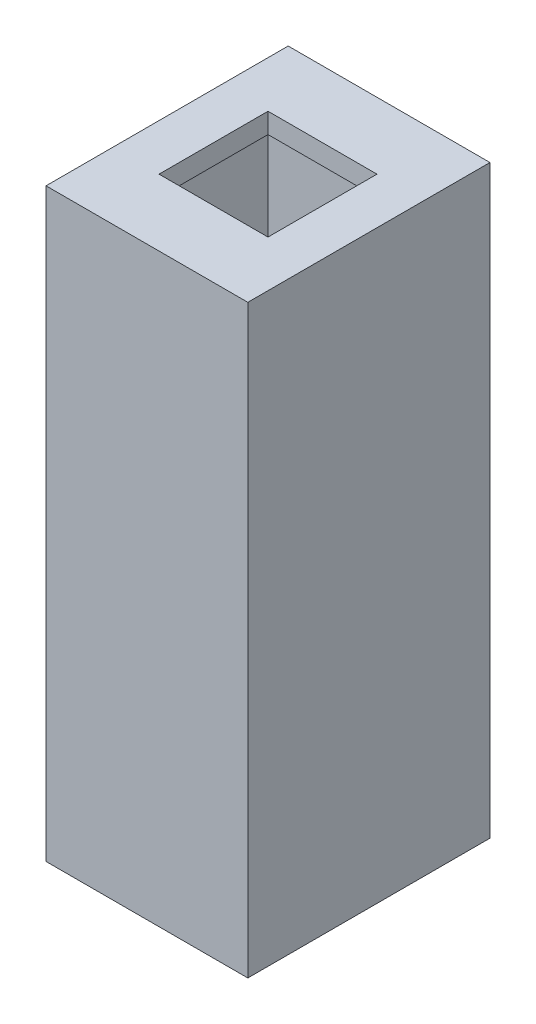
ISO-10303-21;
HEADER;
FILE_DESCRIPTION(('STEP AP214'),'2;1');
FILE_NAME('part.step','',(''),(''),'','','');
FILE_SCHEMA(('AUTOMOTIVE_DESIGN { 1 0 10303 214 1 1 1 1 }'));
ENDSEC;
DATA;
#1=APPLICATION_CONTEXT('core data for automotive mechanical design processes');
#2=APPLICATION_PROTOCOL_DEFINITION('international standard','automotive_design',2000,#1);
#3=PRODUCT_CONTEXT('',#1,'mechanical');
#4=PRODUCT('Part','Part','',(#3));
#5=PRODUCT_RELATED_PRODUCT_CATEGORY('part','',(#4));
#6=PRODUCT_DEFINITION_FORMATION('','',#4);
#7=PRODUCT_DEFINITION_CONTEXT('part definition',#1,'design');
#8=PRODUCT_DEFINITION('design','',#6,#7);
#9=PRODUCT_DEFINITION_SHAPE('','',#8);
#10=(LENGTH_UNIT() NAMED_UNIT(*) SI_UNIT(.MILLI.,.METRE.));
#11=(NAMED_UNIT(*) PLANE_ANGLE_UNIT() SI_UNIT($,.RADIAN.));
#12=(NAMED_UNIT(*) SI_UNIT($,.STERADIAN.) SOLID_ANGLE_UNIT());
#13=UNCERTAINTY_MEASURE_WITH_UNIT(LENGTH_MEASURE(1.E-05),#10,'distance_accuracy_value','');
#14=(GEOMETRIC_REPRESENTATION_CONTEXT(3) GLOBAL_UNCERTAINTY_ASSIGNED_CONTEXT((#13)) GLOBAL_UNIT_ASSIGNED_CONTEXT((#10,
#11,#12)) REPRESENTATION_CONTEXT('',''));
#15=CARTESIAN_POINT('',(0.,0.,0.));
#16=DIRECTION('',(0.,0.,1.));
#17=DIRECTION('',(1.,0.,0.));
#18=AXIS2_PLACEMENT_3D('',#15,#16,#17);
#19=CARTESIAN_POINT('',(0.,29.,-3.1));
#20=DIRECTION('',(0.,0.,-1.));
#21=DIRECTION('',(-1.,0.,0.));
#22=AXIS2_PLACEMENT_3D('',#19,#20,#21);
#23=PLANE('',#22);
#24=DIRECTION('',(0.,-1.,0.));
#25=VECTOR('',#24,1.);
#26=CARTESIAN_POINT('',(3.1,29.,-3.1));
#27=LINE('',#26,#25);
#28=CARTESIAN_POINT('',(3.1,28.,-3.1));
#29=VERTEX_POINT('',#28);
#30=CARTESIAN_POINT('',(3.1,0.,-3.1));
#31=VERTEX_POINT('',#30);
#32=EDGE_CURVE('E73',#29,#31,#27,.T.);
#33=ORIENTED_EDGE('',*,*,#32,.F.);
#34=DIRECTION('',(-1.,0.,0.));
#35=VECTOR('',#34,1.);
#36=CARTESIAN_POINT('',(0.,28.,-3.1));
#37=LINE('',#36,#35);
#38=CARTESIAN_POINT('',(-3.1,28.,-3.1));
#39=VERTEX_POINT('',#38);
#40=EDGE_CURVE('E203',#29,#39,#37,.T.);
#41=ORIENTED_EDGE('',*,*,#40,.T.);
#42=DIRECTION('',(0.,-1.,0.));
#43=VECTOR('',#42,1.);
#44=CARTESIAN_POINT('',(-3.1,29.,-3.1));
#45=LINE('',#44,#43);
#46=CARTESIAN_POINT('',(-3.1,0.,-3.1));
#47=VERTEX_POINT('',#46);
#48=EDGE_CURVE('E241',#39,#47,#45,.T.);
#49=ORIENTED_EDGE('',*,*,#48,.T.);
#50=DIRECTION('',(1.,0.,0.));
#51=VECTOR('',#50,1.);
#52=CARTESIAN_POINT('',(0.,0.,-3.1));
#53=LINE('',#52,#51);
#54=EDGE_CURVE('E230',#47,#31,#53,.T.);
#55=ORIENTED_EDGE('',*,*,#54,.T.);
#56=EDGE_LOOP('',(#33,#41,#49,#55));
#57=FACE_BOUND('',#56,.T.);
#58=ADVANCED_FACE('F65',(#57),#23,.F.);
#59=CARTESIAN_POINT('',(3.1,29.,0.));
#60=DIRECTION('',(1.,0.,0.));
#61=DIRECTION('',(0.,0.,-1.));
#62=AXIS2_PLACEMENT_3D('',#59,#60,#61);
#63=PLANE('',#62);
#64=DIRECTION('',(0.,-1.,0.));
#65=VECTOR('',#64,1.);
#66=CARTESIAN_POINT('',(3.1,29.,3.1));
#67=LINE('',#66,#65);
#68=CARTESIAN_POINT('',(3.1,28.,3.1));
#69=VERTEX_POINT('',#68);
#70=CARTESIAN_POINT('',(3.1,0.,3.1));
#71=VERTEX_POINT('',#70);
#72=EDGE_CURVE('E246',#69,#71,#67,.T.);
#73=ORIENTED_EDGE('',*,*,#72,.F.);
#74=DIRECTION('',(0.,0.,-1.));
#75=VECTOR('',#74,1.);
#76=CARTESIAN_POINT('',(3.1,28.,0.));
#77=LINE('',#76,#75);
#78=EDGE_CURVE('E80',#69,#29,#77,.T.);
#79=ORIENTED_EDGE('',*,*,#78,.T.);
#80=ORIENTED_EDGE('',*,*,#32,.T.);
#81=DIRECTION('',(0.,0.,1.));
#82=VECTOR('',#81,1.);
#83=CARTESIAN_POINT('',(3.1,0.,0.));
#84=LINE('',#83,#82);
#85=EDGE_CURVE('E233',#31,#71,#84,.T.);
#86=ORIENTED_EDGE('',*,*,#85,.T.);
#87=EDGE_LOOP('',(#73,#79,#80,#86));
#88=FACE_BOUND('',#87,.T.);
#89=ADVANCED_FACE('F288',(#88),#63,.F.);
#90=CARTESIAN_POINT('',(0.,29.,3.1));
#91=DIRECTION('',(0.,0.,-1.));
#92=DIRECTION('',(-1.,0.,0.));
#93=AXIS2_PLACEMENT_3D('',#90,#91,#92);
#94=PLANE('',#93);
#95=DIRECTION('',(-1.,0.,0.));
#96=VECTOR('',#95,1.);
#97=CARTESIAN_POINT('',(0.,28.,3.1));
#98=LINE('',#97,#96);
#99=CARTESIAN_POINT('',(-3.1,28.,3.1));
#100=VERTEX_POINT('',#99);
#101=EDGE_CURVE('E88',#69,#100,#98,.T.);
#102=ORIENTED_EDGE('',*,*,#101,.F.);
#103=ORIENTED_EDGE('',*,*,#72,.T.);
#104=DIRECTION('',(1.,0.,0.));
#105=VECTOR('',#104,1.);
#106=CARTESIAN_POINT('',(0.,0.,3.1));
#107=LINE('',#106,#105);
#108=CARTESIAN_POINT('',(-3.1,0.,3.1));
#109=VERTEX_POINT('',#108);
#110=EDGE_CURVE('E236',#109,#71,#107,.T.);
#111=ORIENTED_EDGE('',*,*,#110,.F.);
#112=DIRECTION('',(0.,-1.,0.));
#113=VECTOR('',#112,1.);
#114=CARTESIAN_POINT('',(-3.1,29.,3.1));
#115=LINE('',#114,#113);
#116=EDGE_CURVE('E243',#100,#109,#115,.T.);
#117=ORIENTED_EDGE('',*,*,#116,.F.);
#118=EDGE_LOOP('',(#102,#103,#111,#117));
#119=FACE_BOUND('',#118,.T.);
#120=ADVANCED_FACE('F293',(#119),#94,.T.);
#121=CARTESIAN_POINT('',(5.,29.,0.));
#122=DIRECTION('',(1.,0.,0.));
#123=DIRECTION('',(0.,0.,-1.));
#124=AXIS2_PLACEMENT_3D('',#121,#122,#123);
#125=PLANE('',#124);
#126=DIRECTION('',(0.,0.,1.));
#127=VECTOR('',#126,1.);
#128=CARTESIAN_POINT('',(5.,0.,0.));
#129=LINE('',#128,#127);
#130=CARTESIAN_POINT('',(5.,0.,-6.));
#131=VERTEX_POINT('',#130);
#132=CARTESIAN_POINT('',(5.,0.,6.));
#133=VERTEX_POINT('',#132);
#134=EDGE_CURVE('E206',#131,#133,#129,.T.);
#135=ORIENTED_EDGE('',*,*,#134,.F.);
#136=DIRECTION('',(0.,-1.,0.));
#137=VECTOR('',#136,1.);
#138=CARTESIAN_POINT('',(5.,29.,-6.));
#139=LINE('',#138,#137);
#140=CARTESIAN_POINT('',(5.,29.,-6.));
#141=VERTEX_POINT('',#140);
#142=EDGE_CURVE('E244',#141,#131,#139,.T.);
#143=ORIENTED_EDGE('',*,*,#142,.F.);
#144=DIRECTION('',(0.,0.,1.));
#145=VECTOR('',#144,1.);
#146=CARTESIAN_POINT('',(5.,29.,0.));
#147=LINE('',#146,#145);
#148=CARTESIAN_POINT('',(5.,29.,6.));
#149=VERTEX_POINT('',#148);
#150=EDGE_CURVE('E207',#141,#149,#147,.T.);
#151=ORIENTED_EDGE('',*,*,#150,.T.);
#152=DIRECTION('',(0.,-1.,0.));
#153=VECTOR('',#152,1.);
#154=CARTESIAN_POINT('',(5.,29.,6.));
#155=LINE('',#154,#153);
#156=EDGE_CURVE('E218',#149,#133,#155,.T.);
#157=ORIENTED_EDGE('',*,*,#156,.T.);
#158=EDGE_LOOP('',(#135,#143,#151,#157));
#159=FACE_BOUND('',#158,.T.);
#160=ADVANCED_FACE('F67',(#159),#125,.T.);
#161=CARTESIAN_POINT('',(0.,29.,-6.));
#162=DIRECTION('',(0.,0.,-1.));
#163=DIRECTION('',(-1.,0.,0.));
#164=AXIS2_PLACEMENT_3D('',#161,#162,#163);
#165=PLANE('',#164);
#166=DIRECTION('',(1.,0.,0.));
#167=VECTOR('',#166,1.);
#168=CARTESIAN_POINT('',(0.,0.,-6.));
#169=LINE('',#168,#167);
#170=CARTESIAN_POINT('',(-5.,0.,-6.));
#171=VERTEX_POINT('',#170);
#172=EDGE_CURVE('E221',#171,#131,#169,.T.);
#173=ORIENTED_EDGE('',*,*,#172,.F.);
#174=DIRECTION('',(0.,-1.,0.));
#175=VECTOR('',#174,1.);
#176=CARTESIAN_POINT('',(-5.,29.,-6.));
#177=LINE('',#176,#175);
#178=CARTESIAN_POINT('',(-5.,29.,-6.));
#179=VERTEX_POINT('',#178);
#180=EDGE_CURVE('E252',#179,#171,#177,.T.);
#181=ORIENTED_EDGE('',*,*,#180,.F.);
#182=DIRECTION('',(1.,0.,0.));
#183=VECTOR('',#182,1.);
#184=CARTESIAN_POINT('',(0.,29.,-6.));
#185=LINE('',#184,#183);
#186=EDGE_CURVE('E210',#179,#141,#185,.T.);
#187=ORIENTED_EDGE('',*,*,#186,.T.);
#188=ORIENTED_EDGE('',*,*,#142,.T.);
#189=EDGE_LOOP('',(#173,#181,#187,#188));
#190=FACE_BOUND('',#189,.T.);
#191=ADVANCED_FACE('F256',(#190),#165,.T.);
#192=CARTESIAN_POINT('',(-5.,29.,0.));
#193=DIRECTION('',(1.,0.,0.));
#194=DIRECTION('',(0.,0.,-1.));
#195=AXIS2_PLACEMENT_3D('',#192,#193,#194);
#196=PLANE('',#195);
#197=DIRECTION('',(0.,0.,1.));
#198=VECTOR('',#197,1.);
#199=CARTESIAN_POINT('',(-5.,0.,0.));
#200=LINE('',#199,#198);
#201=CARTESIAN_POINT('',(-5.,0.,6.));
#202=VERTEX_POINT('',#201);
#203=EDGE_CURVE('E224',#171,#202,#200,.T.);
#204=ORIENTED_EDGE('',*,*,#203,.T.);
#205=DIRECTION('',(0.,-1.,0.));
#206=VECTOR('',#205,1.);
#207=CARTESIAN_POINT('',(-5.,29.,6.));
#208=LINE('',#207,#206);
#209=CARTESIAN_POINT('',(-5.,29.,6.));
#210=VERTEX_POINT('',#209);
#211=EDGE_CURVE('E250',#210,#202,#208,.T.);
#212=ORIENTED_EDGE('',*,*,#211,.F.);
#213=DIRECTION('',(0.,0.,1.));
#214=VECTOR('',#213,1.);
#215=CARTESIAN_POINT('',(-5.,29.,0.));
#216=LINE('',#215,#214);
#217=EDGE_CURVE('E214',#179,#210,#216,.T.);
#218=ORIENTED_EDGE('',*,*,#217,.F.);
#219=ORIENTED_EDGE('',*,*,#180,.T.);
#220=EDGE_LOOP('',(#204,#212,#218,#219));
#221=FACE_BOUND('',#220,.T.);
#222=ADVANCED_FACE('F268',(#221),#196,.F.);
#223=CARTESIAN_POINT('',(0.,29.,6.));
#224=DIRECTION('',(0.,0.,-1.));
#225=DIRECTION('',(-1.,0.,0.));
#226=AXIS2_PLACEMENT_3D('',#223,#224,#225);
#227=PLANE('',#226);
#228=DIRECTION('',(1.,0.,0.));
#229=VECTOR('',#228,1.);
#230=CARTESIAN_POINT('',(0.,0.,6.));
#231=LINE('',#230,#229);
#232=EDGE_CURVE('E227',#202,#133,#231,.T.);
#233=ORIENTED_EDGE('',*,*,#232,.T.);
#234=ORIENTED_EDGE('',*,*,#156,.F.);
#235=DIRECTION('',(1.,0.,0.));
#236=VECTOR('',#235,1.);
#237=CARTESIAN_POINT('',(0.,29.,6.));
#238=LINE('',#237,#236);
#239=EDGE_CURVE('E216',#210,#149,#238,.T.);
#240=ORIENTED_EDGE('',*,*,#239,.F.);
#241=ORIENTED_EDGE('',*,*,#211,.T.);
#242=EDGE_LOOP('',(#233,#234,#240,#241));
#243=FACE_BOUND('',#242,.T.);
#244=ADVANCED_FACE('F275',(#243),#227,.F.);
#245=CARTESIAN_POINT('',(-3.1,29.,0.));
#246=DIRECTION('',(1.,0.,0.));
#247=DIRECTION('',(0.,0.,-1.));
#248=AXIS2_PLACEMENT_3D('',#245,#246,#247);
#249=PLANE('',#248);
#250=DIRECTION('',(0.,0.,-1.));
#251=VECTOR('',#250,1.);
#252=CARTESIAN_POINT('',(-3.1,28.,0.));
#253=LINE('',#252,#251);
#254=EDGE_CURVE('E12',#100,#39,#253,.T.);
#255=ORIENTED_EDGE('',*,*,#254,.F.);
#256=ORIENTED_EDGE('',*,*,#116,.T.);
#257=DIRECTION('',(0.,0.,1.));
#258=VECTOR('',#257,1.);
#259=CARTESIAN_POINT('',(-3.1,0.,0.));
#260=LINE('',#259,#258);
#261=EDGE_CURVE('E211',#47,#109,#260,.T.);
#262=ORIENTED_EDGE('',*,*,#261,.F.);
#263=ORIENTED_EDGE('',*,*,#48,.F.);
#264=EDGE_LOOP('',(#255,#256,#262,#263));
#265=FACE_BOUND('',#264,.T.);
#266=ADVANCED_FACE('F277',(#265),#249,.T.);
#267=CARTESIAN_POINT('',(0.,29.,0.));
#268=DIRECTION('',(0.,1.,0.));
#269=DIRECTION('',(0.,0.,1.));
#270=AXIS2_PLACEMENT_3D('',#267,#268,#269);
#271=PLANE('',#270);
#272=ORIENTED_EDGE('',*,*,#150,.F.);
#273=ORIENTED_EDGE('',*,*,#186,.F.);
#274=ORIENTED_EDGE('',*,*,#217,.T.);
#275=ORIENTED_EDGE('',*,*,#239,.T.);
#276=EDGE_LOOP('',(#272,#273,#274,#275));
#277=FACE_BOUND('',#276,.T.);
#278=DIRECTION('',(0.,0.,1.));
#279=VECTOR('',#278,1.);
#280=CARTESIAN_POINT('',(-2.7,29.,0.));
#281=LINE('',#280,#279);
#282=CARTESIAN_POINT('',(-2.7,29.,-2.7));
#283=VERTEX_POINT('',#282);
#284=CARTESIAN_POINT('',(-2.7,29.,2.7));
#285=VERTEX_POINT('',#284);
#286=EDGE_CURVE('E191',#283,#285,#281,.T.);
#287=ORIENTED_EDGE('',*,*,#286,.F.);
#288=DIRECTION('',(-1.,0.,0.));
#289=VECTOR('',#288,1.);
#290=CARTESIAN_POINT('',(0.,29.,-2.7));
#291=LINE('',#290,#289);
#292=CARTESIAN_POINT('',(2.7,29.,-2.7));
#293=VERTEX_POINT('',#292);
#294=EDGE_CURVE('E162',#293,#283,#291,.T.);
#295=ORIENTED_EDGE('',*,*,#294,.F.);
#296=DIRECTION('',(0.,0.,1.));
#297=VECTOR('',#296,1.);
#298=CARTESIAN_POINT('',(2.7,29.,0.));
#299=LINE('',#298,#297);
#300=CARTESIAN_POINT('',(2.7,29.,2.7));
#301=VERTEX_POINT('',#300);
#302=EDGE_CURVE('E179',#293,#301,#299,.T.);
#303=ORIENTED_EDGE('',*,*,#302,.T.);
#304=DIRECTION('',(-1.,0.,0.));
#305=VECTOR('',#304,1.);
#306=CARTESIAN_POINT('',(0.,29.,2.7));
#307=LINE('',#306,#305);
#308=EDGE_CURVE('E182',#301,#285,#307,.T.);
#309=ORIENTED_EDGE('',*,*,#308,.T.);
#310=EDGE_LOOP('',(#287,#295,#303,#309));
#311=FACE_BOUND('',#310,.T.);
#312=ADVANCED_FACE('F272',(#277,#311),#271,.T.);
#313=CARTESIAN_POINT('',(0.,0.,0.));
#314=DIRECTION('',(0.,1.,0.));
#315=DIRECTION('',(0.,0.,1.));
#316=AXIS2_PLACEMENT_3D('',#313,#314,#315);
#317=PLANE('',#316);
#318=CARTESIAN_POINT('',(3.74999999999999,0.,4.5));
#319=DIRECTION('',(0.,-1.,0.));
#320=DIRECTION('',(0.,0.,-1.));
#321=AXIS2_PLACEMENT_3D('',#318,#319,#320);
#322=CIRCLE('',#321,0.3);
#323=CARTESIAN_POINT('',(3.74999999999999,0.,4.2));
#324=VERTEX_POINT('',#323);
#325=EDGE_CURVE('E365',#324,#324,#322,.T.);
#326=ORIENTED_EDGE('',*,*,#325,.F.);
#327=EDGE_LOOP('',(#326));
#328=FACE_BOUND('',#327,.T.);
#329=CARTESIAN_POINT('',(-3.75,0.,-4.5));
#330=DIRECTION('',(0.,-1.,0.));
#331=DIRECTION('',(0.,0.,-1.));
#332=AXIS2_PLACEMENT_3D('',#329,#330,#331);
#333=CIRCLE('',#332,0.3);
#334=CARTESIAN_POINT('',(-3.75,0.,-4.8));
#335=VERTEX_POINT('',#334);
#336=EDGE_CURVE('E361',#335,#335,#333,.T.);
#337=ORIENTED_EDGE('',*,*,#336,.F.);
#338=EDGE_LOOP('',(#337));
#339=FACE_BOUND('',#338,.T.);
#340=CARTESIAN_POINT('',(3.74999999999999,0.,-4.5));
#341=DIRECTION('',(0.,-1.,0.));
#342=DIRECTION('',(0.,0.,-1.));
#343=AXIS2_PLACEMENT_3D('',#340,#341,#342);
#344=CIRCLE('',#343,0.3);
#345=CARTESIAN_POINT('',(3.74999999999999,0.,-4.8));
#346=VERTEX_POINT('',#345);
#347=EDGE_CURVE('E356',#346,#346,#344,.T.);
#348=ORIENTED_EDGE('',*,*,#347,.F.);
#349=EDGE_LOOP('',(#348));
#350=FACE_BOUND('',#349,.T.);
#351=CARTESIAN_POINT('',(-3.75,0.,4.5));
#352=DIRECTION('',(0.,-1.,0.));
#353=DIRECTION('',(0.,0.,-1.));
#354=AXIS2_PLACEMENT_3D('',#351,#352,#353);
#355=CIRCLE('',#354,0.3);
#356=CARTESIAN_POINT('',(-3.75,0.,4.2));
#357=VERTEX_POINT('',#356);
#358=EDGE_CURVE('E185',#357,#357,#355,.T.);
#359=ORIENTED_EDGE('',*,*,#358,.F.);
#360=EDGE_LOOP('',(#359));
#361=FACE_BOUND('',#360,.T.);
#362=ORIENTED_EDGE('',*,*,#134,.T.);
#363=ORIENTED_EDGE('',*,*,#232,.F.);
#364=ORIENTED_EDGE('',*,*,#203,.F.);
#365=ORIENTED_EDGE('',*,*,#172,.T.);
#366=EDGE_LOOP('',(#362,#363,#364,#365));
#367=FACE_BOUND('',#366,.T.);
#368=ORIENTED_EDGE('',*,*,#54,.F.);
#369=ORIENTED_EDGE('',*,*,#261,.T.);
#370=ORIENTED_EDGE('',*,*,#110,.T.);
#371=ORIENTED_EDGE('',*,*,#85,.F.);
#372=EDGE_LOOP('',(#368,#369,#370,#371));
#373=FACE_BOUND('',#372,.T.);
#374=ADVANCED_FACE('F264',(#328,#339,#350,#361,#367,#373),#317,.F.);
#375=CARTESIAN_POINT('',(0.,28.,0.));
#376=DIRECTION('',(0.,-1.,0.));
#377=DIRECTION('',(0.,0.,-1.));
#378=AXIS2_PLACEMENT_3D('',#375,#376,#377);
#379=PLANE('',#378);
#380=DIRECTION('',(-1.,0.,0.));
#381=VECTOR('',#380,1.);
#382=CARTESIAN_POINT('',(0.,28.,-2.7));
#383=LINE('',#382,#381);
#384=CARTESIAN_POINT('',(2.7,28.,-2.7));
#385=VERTEX_POINT('',#384);
#386=CARTESIAN_POINT('',(-2.7,28.,-2.7));
#387=VERTEX_POINT('',#386);
#388=EDGE_CURVE('E159',#385,#387,#383,.T.);
#389=ORIENTED_EDGE('',*,*,#388,.T.);
#390=DIRECTION('',(0.,0.,1.));
#391=VECTOR('',#390,1.);
#392=CARTESIAN_POINT('',(-2.7,28.,0.));
#393=LINE('',#392,#391);
#394=CARTESIAN_POINT('',(-2.7,28.,2.7));
#395=VERTEX_POINT('',#394);
#396=EDGE_CURVE('E170',#387,#395,#393,.T.);
#397=ORIENTED_EDGE('',*,*,#396,.T.);
#398=DIRECTION('',(-1.,0.,0.));
#399=VECTOR('',#398,1.);
#400=CARTESIAN_POINT('',(0.,28.,2.7));
#401=LINE('',#400,#399);
#402=CARTESIAN_POINT('',(2.7,28.,2.7));
#403=VERTEX_POINT('',#402);
#404=EDGE_CURVE('E175',#403,#395,#401,.T.);
#405=ORIENTED_EDGE('',*,*,#404,.F.);
#406=DIRECTION('',(0.,0.,1.));
#407=VECTOR('',#406,1.);
#408=CARTESIAN_POINT('',(2.7,28.,0.));
#409=LINE('',#408,#407);
#410=EDGE_CURVE('E167',#385,#403,#409,.T.);
#411=ORIENTED_EDGE('',*,*,#410,.F.);
#412=EDGE_LOOP('',(#389,#397,#405,#411));
#413=FACE_BOUND('',#412,.T.);
#414=ORIENTED_EDGE('',*,*,#40,.F.);
#415=ORIENTED_EDGE('',*,*,#78,.F.);
#416=ORIENTED_EDGE('',*,*,#101,.T.);
#417=ORIENTED_EDGE('',*,*,#254,.T.);
#418=EDGE_LOOP('',(#414,#415,#416,#417));
#419=FACE_BOUND('',#418,.T.);
#420=ADVANCED_FACE('F177',(#413,#419),#379,.T.);
#421=CARTESIAN_POINT('',(0.,28.,-2.7));
#422=DIRECTION('',(0.,0.,-1.));
#423=DIRECTION('',(-1.,0.,0.));
#424=AXIS2_PLACEMENT_3D('',#421,#422,#423);
#425=PLANE('',#424);
#426=ORIENTED_EDGE('',*,*,#294,.T.);
#427=DIRECTION('',(0.,1.,0.));
#428=VECTOR('',#427,1.);
#429=CARTESIAN_POINT('',(-2.7,28.,-2.7));
#430=LINE('',#429,#428);
#431=EDGE_CURVE('E155',#387,#283,#430,.T.);
#432=ORIENTED_EDGE('',*,*,#431,.F.);
#433=ORIENTED_EDGE('',*,*,#388,.F.);
#434=DIRECTION('',(0.,1.,0.));
#435=VECTOR('',#434,1.);
#436=CARTESIAN_POINT('',(2.7,28.,-2.7));
#437=LINE('',#436,#435);
#438=EDGE_CURVE('E196',#385,#293,#437,.T.);
#439=ORIENTED_EDGE('',*,*,#438,.T.);
#440=EDGE_LOOP('',(#426,#432,#433,#439));
#441=FACE_BOUND('',#440,.T.);
#442=ADVANCED_FACE('F157',(#441),#425,.F.);
#443=CARTESIAN_POINT('',(2.7,28.,0.));
#444=DIRECTION('',(-1.,0.,0.));
#445=DIRECTION('',(0.,0.,1.));
#446=AXIS2_PLACEMENT_3D('',#443,#444,#445);
#447=PLANE('',#446);
#448=ORIENTED_EDGE('',*,*,#302,.F.);
#449=ORIENTED_EDGE('',*,*,#438,.F.);
#450=ORIENTED_EDGE('',*,*,#410,.T.);
#451=DIRECTION('',(0.,1.,0.));
#452=VECTOR('',#451,1.);
#453=CARTESIAN_POINT('',(2.7,28.,2.7));
#454=LINE('',#453,#452);
#455=EDGE_CURVE('E198',#403,#301,#454,.T.);
#456=ORIENTED_EDGE('',*,*,#455,.T.);
#457=EDGE_LOOP('',(#448,#449,#450,#456));
#458=FACE_BOUND('',#457,.T.);
#459=ADVANCED_FACE('F307',(#458),#447,.T.);
#460=CARTESIAN_POINT('',(0.,28.,2.7));
#461=DIRECTION('',(0.,0.,-1.));
#462=DIRECTION('',(-1.,0.,0.));
#463=AXIS2_PLACEMENT_3D('',#460,#461,#462);
#464=PLANE('',#463);
#465=ORIENTED_EDGE('',*,*,#308,.F.);
#466=ORIENTED_EDGE('',*,*,#455,.F.);
#467=ORIENTED_EDGE('',*,*,#404,.T.);
#468=DIRECTION('',(0.,1.,0.));
#469=VECTOR('',#468,1.);
#470=CARTESIAN_POINT('',(-2.7,28.,2.7));
#471=LINE('',#470,#469);
#472=EDGE_CURVE('E166',#395,#285,#471,.T.);
#473=ORIENTED_EDGE('',*,*,#472,.T.);
#474=EDGE_LOOP('',(#465,#466,#467,#473));
#475=FACE_BOUND('',#474,.T.);
#476=ADVANCED_FACE('F311',(#475),#464,.T.);
#477=CARTESIAN_POINT('',(-2.7,28.,0.));
#478=DIRECTION('',(-1.,0.,0.));
#479=DIRECTION('',(0.,0.,1.));
#480=AXIS2_PLACEMENT_3D('',#477,#478,#479);
#481=PLANE('',#480);
#482=ORIENTED_EDGE('',*,*,#286,.T.);
#483=ORIENTED_EDGE('',*,*,#472,.F.);
#484=ORIENTED_EDGE('',*,*,#396,.F.);
#485=ORIENTED_EDGE('',*,*,#431,.T.);
#486=EDGE_LOOP('',(#482,#483,#484,#485));
#487=FACE_BOUND('',#486,.T.);
#488=ADVANCED_FACE('F171',(#487),#481,.F.);
#489=CARTESIAN_POINT('',(-3.75,2.,4.5));
#490=DIRECTION('',(0.,-1.,0.));
#491=DIRECTION('',(0.,0.,-1.));
#492=AXIS2_PLACEMENT_3D('',#489,#490,#491);
#493=CYLINDRICAL_SURFACE('',#492,0.3);
#494=CARTESIAN_POINT('',(-3.75,2.,4.5));
#495=DIRECTION('',(0.,-1.,0.));
#496=DIRECTION('',(0.,0.,-1.));
#497=AXIS2_PLACEMENT_3D('',#494,#495,#496);
#498=CIRCLE('',#497,0.3);
#499=CARTESIAN_POINT('',(-3.75,2.,4.2));
#500=VERTEX_POINT('',#499);
#501=EDGE_CURVE('E192',#500,#500,#498,.T.);
#502=ORIENTED_EDGE('',*,*,#501,.F.);
#503=EDGE_LOOP('',(#502));
#504=FACE_BOUND('',#503,.T.);
#505=ORIENTED_EDGE('',*,*,#358,.T.);
#506=EDGE_LOOP('',(#505));
#507=FACE_BOUND('',#506,.T.);
#508=ADVANCED_FACE('F310',(#504,#507),#493,.F.);
#509=CARTESIAN_POINT('',(-3.75,2.,4.5));
#510=DIRECTION('',(0.,-1.,0.));
#511=DIRECTION('',(0.,0.,-1.));
#512=AXIS2_PLACEMENT_3D('',#509,#510,#511);
#513=PLANE('',#512);
#514=ORIENTED_EDGE('',*,*,#501,.T.);
#515=EDGE_LOOP('',(#514));
#516=FACE_BOUND('',#515,.T.);
#517=ADVANCED_FACE('F320',(#516),#513,.T.);
#518=CARTESIAN_POINT('',(3.74999999999999,2.,-4.5));
#519=DIRECTION('',(0.,-1.,0.));
#520=DIRECTION('',(0.,0.,-1.));
#521=AXIS2_PLACEMENT_3D('',#518,#519,#520);
#522=CYLINDRICAL_SURFACE('',#521,0.3);
#523=CARTESIAN_POINT('',(3.74999999999999,2.,-4.5));
#524=DIRECTION('',(0.,-1.,0.));
#525=DIRECTION('',(0.,0.,-1.));
#526=AXIS2_PLACEMENT_3D('',#523,#524,#525);
#527=CIRCLE('',#526,0.3);
#528=CARTESIAN_POINT('',(3.74999999999999,2.,-4.8));
#529=VERTEX_POINT('',#528);
#530=EDGE_CURVE('E353',#529,#529,#527,.T.);
#531=ORIENTED_EDGE('',*,*,#530,.F.);
#532=EDGE_LOOP('',(#531));
#533=FACE_BOUND('',#532,.T.);
#534=ORIENTED_EDGE('',*,*,#347,.T.);
#535=EDGE_LOOP('',(#534));
#536=FACE_BOUND('',#535,.T.);
#537=ADVANCED_FACE('F324',(#533,#536),#522,.F.);
#538=CARTESIAN_POINT('',(3.74999999999999,2.,-4.5));
#539=DIRECTION('',(0.,-1.,0.));
#540=DIRECTION('',(0.,0.,-1.));
#541=AXIS2_PLACEMENT_3D('',#538,#539,#540);
#542=PLANE('',#541);
#543=ORIENTED_EDGE('',*,*,#530,.T.);
#544=EDGE_LOOP('',(#543));
#545=FACE_BOUND('',#544,.T.);
#546=ADVANCED_FACE('F334',(#545),#542,.T.);
#547=CARTESIAN_POINT('',(-3.75,2.,-4.5));
#548=DIRECTION('',(0.,-1.,0.));
#549=DIRECTION('',(0.,0.,-1.));
#550=AXIS2_PLACEMENT_3D('',#547,#548,#549);
#551=CYLINDRICAL_SURFACE('',#550,0.3);
#552=CARTESIAN_POINT('',(-3.75,2.,-4.5));
#553=DIRECTION('',(0.,-1.,0.));
#554=DIRECTION('',(0.,0.,-1.));
#555=AXIS2_PLACEMENT_3D('',#552,#553,#554);
#556=CIRCLE('',#555,0.3);
#557=CARTESIAN_POINT('',(-3.75,2.,-4.8));
#558=VERTEX_POINT('',#557);
#559=EDGE_CURVE('E358',#558,#558,#556,.T.);
#560=ORIENTED_EDGE('',*,*,#559,.F.);
#561=EDGE_LOOP('',(#560));
#562=FACE_BOUND('',#561,.T.);
#563=ORIENTED_EDGE('',*,*,#336,.T.);
#564=EDGE_LOOP('',(#563));
#565=FACE_BOUND('',#564,.T.);
#566=ADVANCED_FACE('F330',(#562,#565),#551,.F.);
#567=CARTESIAN_POINT('',(-3.75,2.,-4.5));
#568=DIRECTION('',(0.,-1.,0.));
#569=DIRECTION('',(0.,0.,-1.));
#570=AXIS2_PLACEMENT_3D('',#567,#568,#569);
#571=PLANE('',#570);
#572=ORIENTED_EDGE('',*,*,#559,.T.);
#573=EDGE_LOOP('',(#572));
#574=FACE_BOUND('',#573,.T.);
#575=ADVANCED_FACE('F326',(#574),#571,.T.);
#576=CARTESIAN_POINT('',(3.74999999999999,2.,4.5));
#577=DIRECTION('',(0.,-1.,0.));
#578=DIRECTION('',(0.,0.,-1.));
#579=AXIS2_PLACEMENT_3D('',#576,#577,#578);
#580=CYLINDRICAL_SURFACE('',#579,0.3);
#581=CARTESIAN_POINT('',(3.74999999999999,2.,4.5));
#582=DIRECTION('',(0.,-1.,0.));
#583=DIRECTION('',(0.,0.,-1.));
#584=AXIS2_PLACEMENT_3D('',#581,#582,#583);
#585=CIRCLE('',#584,0.3);
#586=CARTESIAN_POINT('',(3.74999999999999,2.,4.2));
#587=VERTEX_POINT('',#586);
#588=EDGE_CURVE('E368',#587,#587,#585,.T.);
#589=ORIENTED_EDGE('',*,*,#588,.F.);
#590=EDGE_LOOP('',(#589));
#591=FACE_BOUND('',#590,.T.);
#592=ORIENTED_EDGE('',*,*,#325,.T.);
#593=EDGE_LOOP('',(#592));
#594=FACE_BOUND('',#593,.T.);
#595=ADVANCED_FACE('F329',(#591,#594),#580,.F.);
#596=CARTESIAN_POINT('',(3.74999999999999,2.,4.5));
#597=DIRECTION('',(0.,-1.,0.));
#598=DIRECTION('',(0.,0.,-1.));
#599=AXIS2_PLACEMENT_3D('',#596,#597,#598);
#600=PLANE('',#599);
#601=ORIENTED_EDGE('',*,*,#588,.T.);
#602=EDGE_LOOP('',(#601));
#603=FACE_BOUND('',#602,.T.);
#604=ADVANCED_FACE('F336',(#603),#600,.T.);
#605=CLOSED_SHELL('',(#58,#89,#120,#160,#191,#222,#244,#266,#312,#374,#420,#442,#459,#476,#488,
#508,#517,#537,#546,#566,#575,#595,#604));
#606=MANIFOLD_SOLID_BREP('B2',#605);
#607=ADVANCED_BREP_SHAPE_REPRESENTATION('',(#18,#606),#14);
#608=SHAPE_DEFINITION_REPRESENTATION(#9,#607);
ENDSEC;
END-ISO-10303-21;
